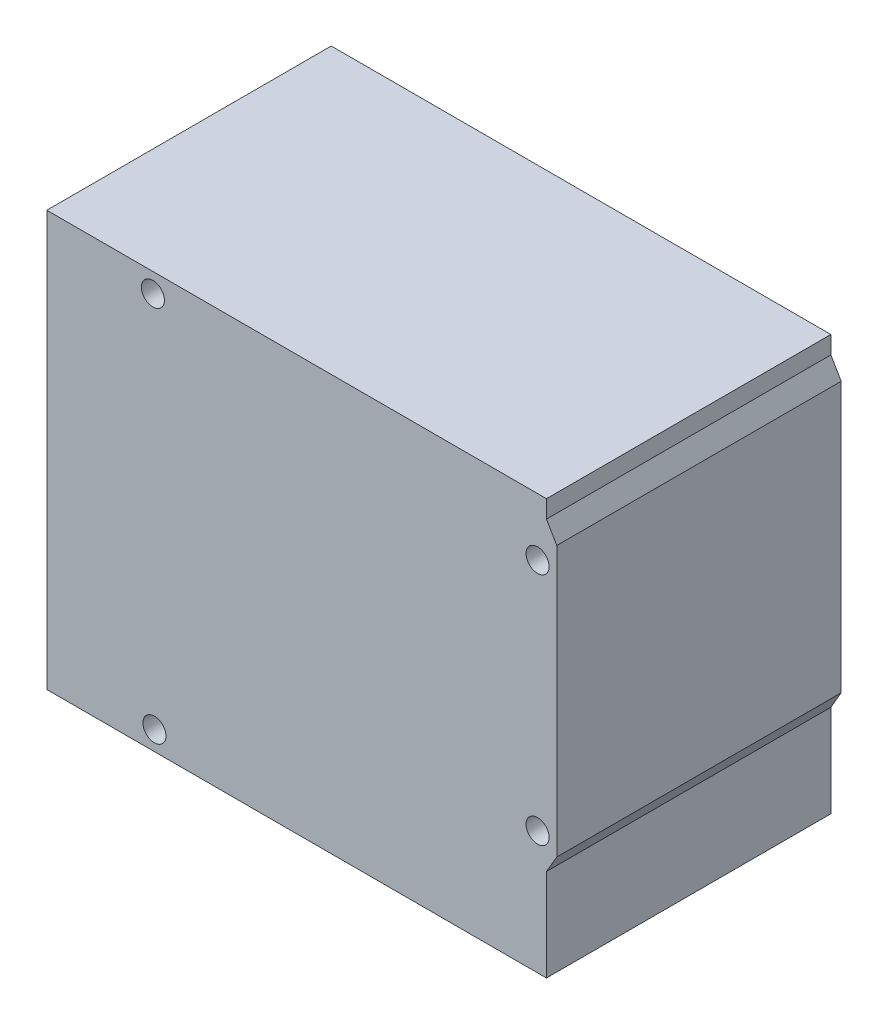
ISO-10303-21;
HEADER;
FILE_DESCRIPTION(('STEP AP214'),'2;1');
FILE_NAME('part.step','',(''),(''),'','','');
FILE_SCHEMA(('AUTOMOTIVE_DESIGN { 1 0 10303 214 1 1 1 1 }'));
ENDSEC;
DATA;
#1=APPLICATION_CONTEXT('core data for automotive mechanical design processes');
#2=APPLICATION_PROTOCOL_DEFINITION('international standard','automotive_design',2000,#1);
#3=PRODUCT_CONTEXT('',#1,'mechanical');
#4=PRODUCT('Part','Part','',(#3));
#5=PRODUCT_RELATED_PRODUCT_CATEGORY('part','',(#4));
#6=PRODUCT_DEFINITION_FORMATION('','',#4);
#7=PRODUCT_DEFINITION_CONTEXT('part definition',#1,'design');
#8=PRODUCT_DEFINITION('design','',#6,#7);
#9=PRODUCT_DEFINITION_SHAPE('','',#8);
#10=(LENGTH_UNIT() NAMED_UNIT(*) SI_UNIT(.MILLI.,.METRE.));
#11=(NAMED_UNIT(*) PLANE_ANGLE_UNIT() SI_UNIT($,.RADIAN.));
#12=(NAMED_UNIT(*) SI_UNIT($,.STERADIAN.) SOLID_ANGLE_UNIT());
#13=UNCERTAINTY_MEASURE_WITH_UNIT(LENGTH_MEASURE(1.E-05),#10,'distance_accuracy_value','');
#14=(GEOMETRIC_REPRESENTATION_CONTEXT(3) GLOBAL_UNCERTAINTY_ASSIGNED_CONTEXT((#13)) GLOBAL_UNIT_ASSIGNED_CONTEXT((#10,
#11,#12)) REPRESENTATION_CONTEXT('',''));
#15=CARTESIAN_POINT('',(0.,0.,0.));
#16=DIRECTION('',(0.,0.,1.));
#17=DIRECTION('',(1.,0.,0.));
#18=AXIS2_PLACEMENT_3D('',#15,#16,#17);
#19=CARTESIAN_POINT('',(0.,0.,37.));
#20=DIRECTION('',(0.,0.,-1.));
#21=DIRECTION('',(-1.,0.,0.));
#22=AXIS2_PLACEMENT_3D('',#19,#20,#21);
#23=PLANE('',#22);
#24=CARTESIAN_POINT('',(63.841321595081,16.,37.));
#25=DIRECTION('',(0.,0.,1.));
#26=DIRECTION('',(1.,0.,0.));
#27=AXIS2_PLACEMENT_3D('',#24,#25,#26);
#28=CIRCLE('',#27,1.5);
#29=CARTESIAN_POINT('',(65.341321595081,16.,37.));
#30=VERTEX_POINT('',#29);
#31=EDGE_CURVE('E188',#30,#30,#28,.T.);
#32=ORIENTED_EDGE('',*,*,#31,.F.);
#33=EDGE_LOOP('',(#32));
#34=FACE_BOUND('',#33,.T.);
#35=CARTESIAN_POINT('',(13.8,51.5,37.));
#36=DIRECTION('',(0.,0.,1.));
#37=DIRECTION('',(1.,0.,0.));
#38=AXIS2_PLACEMENT_3D('',#35,#36,#37);
#39=CIRCLE('',#38,1.5);
#40=CARTESIAN_POINT('',(15.3,51.5,37.));
#41=VERTEX_POINT('',#40);
#42=EDGE_CURVE('E134',#41,#41,#39,.T.);
#43=ORIENTED_EDGE('',*,*,#42,.F.);
#44=EDGE_LOOP('',(#43));
#45=FACE_BOUND('',#44,.T.);
#46=DIRECTION('',(1.,0.,0.));
#47=VECTOR('',#46,1.);
#48=CARTESIAN_POINT('',(65.,0.,37.));
#49=LINE('',#48,#47);
#50=CARTESIAN_POINT('',(0.,0.,37.));
#51=VERTEX_POINT('',#50);
#52=CARTESIAN_POINT('',(65.,0.,37.));
#53=VERTEX_POINT('',#52);
#54=EDGE_CURVE('E145',#51,#53,#49,.T.);
#55=ORIENTED_EDGE('',*,*,#54,.T.);
#56=DIRECTION('',(0.,1.,0.));
#57=VECTOR('',#56,1.);
#58=CARTESIAN_POINT('',(65.,12.,37.));
#59=LINE('',#58,#57);
#60=CARTESIAN_POINT('',(65.,12.,37.));
#61=VERTEX_POINT('',#60);
#62=EDGE_CURVE('E93',#53,#61,#59,.T.);
#63=ORIENTED_EDGE('',*,*,#62,.T.);
#64=DIRECTION('',(0.503774324365997,0.86383530265299,0.));
#65=VECTOR('',#64,1.);
#66=CARTESIAN_POINT('',(66.341321595081,14.3,37.));
#67=LINE('',#66,#65);
#68=CARTESIAN_POINT('',(66.341321595081,14.3,37.));
#69=VERTEX_POINT('',#68);
#70=EDGE_CURVE('E160',#61,#69,#67,.T.);
#71=ORIENTED_EDGE('',*,*,#70,.T.);
#72=DIRECTION('',(0.,1.,0.));
#73=VECTOR('',#72,1.);
#74=CARTESIAN_POINT('',(66.341321595081,49.4,37.));
#75=LINE('',#74,#73);
#76=CARTESIAN_POINT('',(66.341321595081,49.4,37.));
#77=VERTEX_POINT('',#76);
#78=EDGE_CURVE('E173',#69,#77,#75,.T.);
#79=ORIENTED_EDGE('',*,*,#78,.T.);
#80=DIRECTION('',(-0.503774324365997,0.86383530265299,0.));
#81=VECTOR('',#80,1.);
#82=CARTESIAN_POINT('',(65.,51.7,37.));
#83=LINE('',#82,#81);
#84=CARTESIAN_POINT('',(65.,51.7,37.));
#85=VERTEX_POINT('',#84);
#86=EDGE_CURVE('E112',#77,#85,#83,.T.);
#87=ORIENTED_EDGE('',*,*,#86,.T.);
#88=DIRECTION('',(0.,1.,0.));
#89=VECTOR('',#88,1.);
#90=CARTESIAN_POINT('',(65.,54.,37.));
#91=LINE('',#90,#89);
#92=CARTESIAN_POINT('',(65.,54.,37.));
#93=VERTEX_POINT('',#92);
#94=EDGE_CURVE('E106',#85,#93,#91,.T.);
#95=ORIENTED_EDGE('',*,*,#94,.T.);
#96=DIRECTION('',(-1.,0.,0.));
#97=VECTOR('',#96,1.);
#98=CARTESIAN_POINT('',(0.,54.,37.));
#99=LINE('',#98,#97);
#100=CARTESIAN_POINT('',(0.,54.,37.));
#101=VERTEX_POINT('',#100);
#102=EDGE_CURVE('E110',#93,#101,#99,.T.);
#103=ORIENTED_EDGE('',*,*,#102,.T.);
#104=DIRECTION('',(0.,-1.,0.));
#105=VECTOR('',#104,1.);
#106=CARTESIAN_POINT('',(0.,0.,37.));
#107=LINE('',#106,#105);
#108=EDGE_CURVE('E50',#101,#51,#107,.T.);
#109=ORIENTED_EDGE('',*,*,#108,.T.);
#110=EDGE_LOOP('',(#55,#63,#71,#79,#87,#95,#103,#109));
#111=FACE_BOUND('',#110,.T.);
#112=CARTESIAN_POINT('',(63.841321595081,46.5,37.));
#113=DIRECTION('',(0.,0.,1.));
#114=DIRECTION('',(1.,0.,0.));
#115=AXIS2_PLACEMENT_3D('',#112,#113,#114);
#116=CIRCLE('',#115,1.5);
#117=CARTESIAN_POINT('',(65.341321595081,46.5,37.));
#118=VERTEX_POINT('',#117);
#119=EDGE_CURVE('E182',#118,#118,#116,.T.);
#120=ORIENTED_EDGE('',*,*,#119,.F.);
#121=EDGE_LOOP('',(#120));
#122=FACE_BOUND('',#121,.T.);
#123=CARTESIAN_POINT('',(14.,2.49999999999999,37.));
#124=DIRECTION('',(0.,0.,1.));
#125=DIRECTION('',(1.,0.,0.));
#126=AXIS2_PLACEMENT_3D('',#123,#124,#125);
#127=CIRCLE('',#126,1.5);
#128=CARTESIAN_POINT('',(15.5,2.49999999999999,37.));
#129=VERTEX_POINT('',#128);
#130=EDGE_CURVE('E194',#129,#129,#127,.T.);
#131=ORIENTED_EDGE('',*,*,#130,.F.);
#132=EDGE_LOOP('',(#131));
#133=FACE_BOUND('',#132,.T.);
#134=ADVANCED_FACE('F33',(#34,#45,#111,#122,#133),#23,.F.);
#135=CARTESIAN_POINT('',(0.,0.,0.));
#136=DIRECTION('',(0.,0.,-1.));
#137=DIRECTION('',(-1.,0.,0.));
#138=AXIS2_PLACEMENT_3D('',#135,#136,#137);
#139=PLANE('',#138);
#140=CARTESIAN_POINT('',(63.841321595081,16.,0.));
#141=DIRECTION('',(0.,0.,1.));
#142=DIRECTION('',(1.,0.,0.));
#143=AXIS2_PLACEMENT_3D('',#140,#141,#142);
#144=CIRCLE('',#143,1.5);
#145=CARTESIAN_POINT('',(65.341321595081,16.,0.));
#146=VERTEX_POINT('',#145);
#147=EDGE_CURVE('E191',#146,#146,#144,.T.);
#148=ORIENTED_EDGE('',*,*,#147,.T.);
#149=EDGE_LOOP('',(#148));
#150=FACE_BOUND('',#149,.T.);
#151=CARTESIAN_POINT('',(13.8,51.5,0.));
#152=DIRECTION('',(0.,0.,1.));
#153=DIRECTION('',(1.,0.,0.));
#154=AXIS2_PLACEMENT_3D('',#151,#152,#153);
#155=CIRCLE('',#154,1.5);
#156=CARTESIAN_POINT('',(15.3,51.5,0.));
#157=VERTEX_POINT('',#156);
#158=EDGE_CURVE('E179',#157,#157,#155,.T.);
#159=ORIENTED_EDGE('',*,*,#158,.T.);
#160=EDGE_LOOP('',(#159));
#161=FACE_BOUND('',#160,.T.);
#162=DIRECTION('',(1.,0.,0.));
#163=VECTOR('',#162,1.);
#164=CARTESIAN_POINT('',(65.,0.,0.));
#165=LINE('',#164,#163);
#166=CARTESIAN_POINT('',(0.,0.,0.));
#167=VERTEX_POINT('',#166);
#168=CARTESIAN_POINT('',(65.,0.,0.));
#169=VERTEX_POINT('',#168);
#170=EDGE_CURVE('E130',#167,#169,#165,.T.);
#171=ORIENTED_EDGE('',*,*,#170,.F.);
#172=DIRECTION('',(0.,-1.,0.));
#173=VECTOR('',#172,1.);
#174=CARTESIAN_POINT('',(0.,0.,0.));
#175=LINE('',#174,#173);
#176=CARTESIAN_POINT('',(0.,54.,0.));
#177=VERTEX_POINT('',#176);
#178=EDGE_CURVE('E85',#177,#167,#175,.T.);
#179=ORIENTED_EDGE('',*,*,#178,.F.);
#180=DIRECTION('',(-1.,0.,0.));
#181=VECTOR('',#180,1.);
#182=CARTESIAN_POINT('',(0.,54.,0.));
#183=LINE('',#182,#181);
#184=CARTESIAN_POINT('',(65.,54.,0.));
#185=VERTEX_POINT('',#184);
#186=EDGE_CURVE('E79',#185,#177,#183,.T.);
#187=ORIENTED_EDGE('',*,*,#186,.F.);
#188=DIRECTION('',(0.,1.,0.));
#189=VECTOR('',#188,1.);
#190=CARTESIAN_POINT('',(65.,54.,0.));
#191=LINE('',#190,#189);
#192=CARTESIAN_POINT('',(65.,51.7,0.));
#193=VERTEX_POINT('',#192);
#194=EDGE_CURVE('E120',#193,#185,#191,.T.);
#195=ORIENTED_EDGE('',*,*,#194,.F.);
#196=DIRECTION('',(-0.503774324365997,0.86383530265299,0.));
#197=VECTOR('',#196,1.);
#198=CARTESIAN_POINT('',(65.,51.7,0.));
#199=LINE('',#198,#197);
#200=CARTESIAN_POINT('',(66.341321595081,49.4,0.));
#201=VERTEX_POINT('',#200);
#202=EDGE_CURVE('E140',#201,#193,#199,.T.);
#203=ORIENTED_EDGE('',*,*,#202,.F.);
#204=DIRECTION('',(0.,1.,0.));
#205=VECTOR('',#204,1.);
#206=CARTESIAN_POINT('',(66.341321595081,49.4,0.));
#207=LINE('',#206,#205);
#208=CARTESIAN_POINT('',(66.341321595081,14.3,0.));
#209=VERTEX_POINT('',#208);
#210=EDGE_CURVE('E138',#209,#201,#207,.T.);
#211=ORIENTED_EDGE('',*,*,#210,.F.);
#212=DIRECTION('',(0.503774324365997,0.86383530265299,0.));
#213=VECTOR('',#212,1.);
#214=CARTESIAN_POINT('',(66.341321595081,14.3,0.));
#215=LINE('',#214,#213);
#216=CARTESIAN_POINT('',(65.,12.,0.));
#217=VERTEX_POINT('',#216);
#218=EDGE_CURVE('E136',#217,#209,#215,.T.);
#219=ORIENTED_EDGE('',*,*,#218,.F.);
#220=DIRECTION('',(0.,1.,0.));
#221=VECTOR('',#220,1.);
#222=CARTESIAN_POINT('',(65.,12.,0.));
#223=LINE('',#222,#221);
#224=EDGE_CURVE('E133',#169,#217,#223,.T.);
#225=ORIENTED_EDGE('',*,*,#224,.F.);
#226=EDGE_LOOP('',(#171,#179,#187,#195,#203,#211,#219,#225));
#227=FACE_BOUND('',#226,.T.);
#228=CARTESIAN_POINT('',(63.841321595081,46.5,0.));
#229=DIRECTION('',(0.,0.,1.));
#230=DIRECTION('',(1.,0.,0.));
#231=AXIS2_PLACEMENT_3D('',#228,#229,#230);
#232=CIRCLE('',#231,1.5);
#233=CARTESIAN_POINT('',(65.341321595081,46.5,0.));
#234=VERTEX_POINT('',#233);
#235=EDGE_CURVE('E185',#234,#234,#232,.T.);
#236=ORIENTED_EDGE('',*,*,#235,.T.);
#237=EDGE_LOOP('',(#236));
#238=FACE_BOUND('',#237,.T.);
#239=CARTESIAN_POINT('',(14.,2.49999999999999,0.));
#240=DIRECTION('',(0.,0.,1.));
#241=DIRECTION('',(1.,0.,0.));
#242=AXIS2_PLACEMENT_3D('',#239,#240,#241);
#243=CIRCLE('',#242,1.5);
#244=CARTESIAN_POINT('',(15.5,2.49999999999999,0.));
#245=VERTEX_POINT('',#244);
#246=EDGE_CURVE('E197',#245,#245,#243,.T.);
#247=ORIENTED_EDGE('',*,*,#246,.T.);
#248=EDGE_LOOP('',(#247));
#249=FACE_BOUND('',#248,.T.);
#250=ADVANCED_FACE('F164',(#150,#161,#227,#238,#249),#139,.T.);
#251=CARTESIAN_POINT('',(65.,0.,37.));
#252=DIRECTION('',(0.,1.,0.));
#253=DIRECTION('',(-1.,0.,0.));
#254=AXIS2_PLACEMENT_3D('',#251,#252,#253);
#255=PLANE('',#254);
#256=ORIENTED_EDGE('',*,*,#170,.T.);
#257=DIRECTION('',(0.,0.,-1.));
#258=VECTOR('',#257,1.);
#259=CARTESIAN_POINT('',(65.,0.,37.));
#260=LINE('',#259,#258);
#261=EDGE_CURVE('E11',#53,#169,#260,.T.);
#262=ORIENTED_EDGE('',*,*,#261,.F.);
#263=ORIENTED_EDGE('',*,*,#54,.F.);
#264=DIRECTION('',(0.,0.,-1.));
#265=VECTOR('',#264,1.);
#266=CARTESIAN_POINT('',(0.,0.,37.));
#267=LINE('',#266,#265);
#268=EDGE_CURVE('E126',#51,#167,#267,.T.);
#269=ORIENTED_EDGE('',*,*,#268,.T.);
#270=EDGE_LOOP('',(#256,#262,#263,#269));
#271=FACE_BOUND('',#270,.T.);
#272=ADVANCED_FACE('F35',(#271),#255,.F.);
#273=CARTESIAN_POINT('',(65.,12.,37.));
#274=DIRECTION('',(-1.,0.,0.));
#275=DIRECTION('',(0.,0.,1.));
#276=AXIS2_PLACEMENT_3D('',#273,#274,#275);
#277=PLANE('',#276);
#278=ORIENTED_EDGE('',*,*,#224,.T.);
#279=DIRECTION('',(0.,0.,-1.));
#280=VECTOR('',#279,1.);
#281=CARTESIAN_POINT('',(65.,12.,37.));
#282=LINE('',#281,#280);
#283=EDGE_CURVE('E42',#61,#217,#282,.T.);
#284=ORIENTED_EDGE('',*,*,#283,.F.);
#285=ORIENTED_EDGE('',*,*,#62,.F.);
#286=ORIENTED_EDGE('',*,*,#261,.T.);
#287=EDGE_LOOP('',(#278,#284,#285,#286));
#288=FACE_BOUND('',#287,.T.);
#289=ADVANCED_FACE('F232',(#288),#277,.F.);
#290=CARTESIAN_POINT('',(66.341321595081,14.3,37.));
#291=DIRECTION('',(-0.86383530265299,0.503774324365997,0.));
#292=DIRECTION('',(-0.503774324365997,-0.86383530265299,0.));
#293=AXIS2_PLACEMENT_3D('',#290,#291,#292);
#294=PLANE('',#293);
#295=ORIENTED_EDGE('',*,*,#218,.T.);
#296=DIRECTION('',(0.,0.,-1.));
#297=VECTOR('',#296,1.);
#298=CARTESIAN_POINT('',(66.341321595081,14.3,37.));
#299=LINE('',#298,#297);
#300=EDGE_CURVE('E152',#69,#209,#299,.T.);
#301=ORIENTED_EDGE('',*,*,#300,.F.);
#302=ORIENTED_EDGE('',*,*,#70,.F.);
#303=ORIENTED_EDGE('',*,*,#283,.T.);
#304=EDGE_LOOP('',(#295,#301,#302,#303));
#305=FACE_BOUND('',#304,.T.);
#306=ADVANCED_FACE('F158',(#305),#294,.F.);
#307=CARTESIAN_POINT('',(66.341321595081,49.4,37.));
#308=DIRECTION('',(-1.,0.,0.));
#309=DIRECTION('',(0.,0.,1.));
#310=AXIS2_PLACEMENT_3D('',#307,#308,#309);
#311=PLANE('',#310);
#312=ORIENTED_EDGE('',*,*,#210,.T.);
#313=DIRECTION('',(0.,0.,-1.));
#314=VECTOR('',#313,1.);
#315=CARTESIAN_POINT('',(66.341321595081,49.4,37.));
#316=LINE('',#315,#314);
#317=EDGE_CURVE('E149',#77,#201,#316,.T.);
#318=ORIENTED_EDGE('',*,*,#317,.F.);
#319=ORIENTED_EDGE('',*,*,#78,.F.);
#320=ORIENTED_EDGE('',*,*,#300,.T.);
#321=EDGE_LOOP('',(#312,#318,#319,#320));
#322=FACE_BOUND('',#321,.T.);
#323=ADVANCED_FACE('F169',(#322),#311,.F.);
#324=CARTESIAN_POINT('',(65.,51.7,37.));
#325=DIRECTION('',(-0.86383530265299,-0.503774324365997,0.));
#326=DIRECTION('',(0.503774324365997,-0.86383530265299,0.));
#327=AXIS2_PLACEMENT_3D('',#324,#325,#326);
#328=PLANE('',#327);
#329=ORIENTED_EDGE('',*,*,#202,.T.);
#330=DIRECTION('',(0.,0.,-1.));
#331=VECTOR('',#330,1.);
#332=CARTESIAN_POINT('',(65.,51.7,37.));
#333=LINE('',#332,#331);
#334=EDGE_CURVE('E121',#85,#193,#333,.T.);
#335=ORIENTED_EDGE('',*,*,#334,.F.);
#336=ORIENTED_EDGE('',*,*,#86,.F.);
#337=ORIENTED_EDGE('',*,*,#317,.T.);
#338=EDGE_LOOP('',(#329,#335,#336,#337));
#339=FACE_BOUND('',#338,.T.);
#340=ADVANCED_FACE('F172',(#339),#328,.F.);
#341=CARTESIAN_POINT('',(65.,54.,37.));
#342=DIRECTION('',(-1.,0.,0.));
#343=DIRECTION('',(0.,0.,1.));
#344=AXIS2_PLACEMENT_3D('',#341,#342,#343);
#345=PLANE('',#344);
#346=ORIENTED_EDGE('',*,*,#194,.T.);
#347=DIRECTION('',(0.,0.,-1.));
#348=VECTOR('',#347,1.);
#349=CARTESIAN_POINT('',(65.,54.,37.));
#350=LINE('',#349,#348);
#351=EDGE_CURVE('E117',#93,#185,#350,.T.);
#352=ORIENTED_EDGE('',*,*,#351,.F.);
#353=ORIENTED_EDGE('',*,*,#94,.F.);
#354=ORIENTED_EDGE('',*,*,#334,.T.);
#355=EDGE_LOOP('',(#346,#352,#353,#354));
#356=FACE_BOUND('',#355,.T.);
#357=ADVANCED_FACE('F118',(#356),#345,.F.);
#358=CARTESIAN_POINT('',(0.,54.,37.));
#359=DIRECTION('',(0.,-1.,0.));
#360=DIRECTION('',(0.,0.,-1.));
#361=AXIS2_PLACEMENT_3D('',#358,#359,#360);
#362=PLANE('',#361);
#363=ORIENTED_EDGE('',*,*,#186,.T.);
#364=DIRECTION('',(0.,0.,-1.));
#365=VECTOR('',#364,1.);
#366=CARTESIAN_POINT('',(0.,54.,37.));
#367=LINE('',#366,#365);
#368=EDGE_CURVE('E122',#101,#177,#367,.T.);
#369=ORIENTED_EDGE('',*,*,#368,.F.);
#370=ORIENTED_EDGE('',*,*,#102,.F.);
#371=ORIENTED_EDGE('',*,*,#351,.T.);
#372=EDGE_LOOP('',(#363,#369,#370,#371));
#373=FACE_BOUND('',#372,.T.);
#374=ADVANCED_FACE('F124',(#373),#362,.F.);
#375=CARTESIAN_POINT('',(0.,0.,37.));
#376=DIRECTION('',(1.,0.,0.));
#377=DIRECTION('',(0.,0.,-1.));
#378=AXIS2_PLACEMENT_3D('',#375,#376,#377);
#379=PLANE('',#378);
#380=ORIENTED_EDGE('',*,*,#178,.T.);
#381=ORIENTED_EDGE('',*,*,#268,.F.);
#382=ORIENTED_EDGE('',*,*,#108,.F.);
#383=ORIENTED_EDGE('',*,*,#368,.T.);
#384=EDGE_LOOP('',(#380,#381,#382,#383));
#385=FACE_BOUND('',#384,.T.);
#386=ADVANCED_FACE('F220',(#385),#379,.F.);
#387=CARTESIAN_POINT('',(13.8,51.5,37.));
#388=DIRECTION('',(0.,0.,-1.));
#389=DIRECTION('',(-1.,0.,0.));
#390=AXIS2_PLACEMENT_3D('',#387,#388,#389);
#391=CYLINDRICAL_SURFACE('',#390,1.5);
#392=ORIENTED_EDGE('',*,*,#42,.T.);
#393=EDGE_LOOP('',(#392));
#394=FACE_BOUND('',#393,.T.);
#395=ORIENTED_EDGE('',*,*,#158,.F.);
#396=EDGE_LOOP('',(#395));
#397=FACE_BOUND('',#396,.T.);
#398=ADVANCED_FACE('F217',(#394,#397),#391,.F.);
#399=CARTESIAN_POINT('',(63.841321595081,46.5,37.));
#400=DIRECTION('',(0.,0.,-1.));
#401=DIRECTION('',(-1.,0.,0.));
#402=AXIS2_PLACEMENT_3D('',#399,#400,#401);
#403=CYLINDRICAL_SURFACE('',#402,1.5);
#404=ORIENTED_EDGE('',*,*,#119,.T.);
#405=EDGE_LOOP('',(#404));
#406=FACE_BOUND('',#405,.T.);
#407=ORIENTED_EDGE('',*,*,#235,.F.);
#408=EDGE_LOOP('',(#407));
#409=FACE_BOUND('',#408,.T.);
#410=ADVANCED_FACE('F296',(#406,#409),#403,.F.);
#411=CARTESIAN_POINT('',(63.841321595081,16.,37.));
#412=DIRECTION('',(0.,0.,-1.));
#413=DIRECTION('',(-1.,0.,0.));
#414=AXIS2_PLACEMENT_3D('',#411,#412,#413);
#415=CYLINDRICAL_SURFACE('',#414,1.5);
#416=ORIENTED_EDGE('',*,*,#31,.T.);
#417=EDGE_LOOP('',(#416));
#418=FACE_BOUND('',#417,.T.);
#419=ORIENTED_EDGE('',*,*,#147,.F.);
#420=EDGE_LOOP('',(#419));
#421=FACE_BOUND('',#420,.T.);
#422=ADVANCED_FACE('F304',(#418,#421),#415,.F.);
#423=CARTESIAN_POINT('',(14.,2.49999999999999,37.));
#424=DIRECTION('',(0.,0.,-1.));
#425=DIRECTION('',(-1.,0.,0.));
#426=AXIS2_PLACEMENT_3D('',#423,#424,#425);
#427=CYLINDRICAL_SURFACE('',#426,1.5);
#428=ORIENTED_EDGE('',*,*,#130,.T.);
#429=EDGE_LOOP('',(#428));
#430=FACE_BOUND('',#429,.T.);
#431=ORIENTED_EDGE('',*,*,#246,.F.);
#432=EDGE_LOOP('',(#431));
#433=FACE_BOUND('',#432,.T.);
#434=ADVANCED_FACE('F203',(#430,#433),#427,.F.);
#435=CLOSED_SHELL('',(#134,#250,#272,#289,#306,#323,#340,#357,#374,#386,#398,#410,#422,#434));
#436=MANIFOLD_SOLID_BREP('B2',#435);
#437=ADVANCED_BREP_SHAPE_REPRESENTATION('',(#18,#436),#14);
#438=SHAPE_DEFINITION_REPRESENTATION(#9,#437);
ENDSEC;
END-ISO-10303-21;
